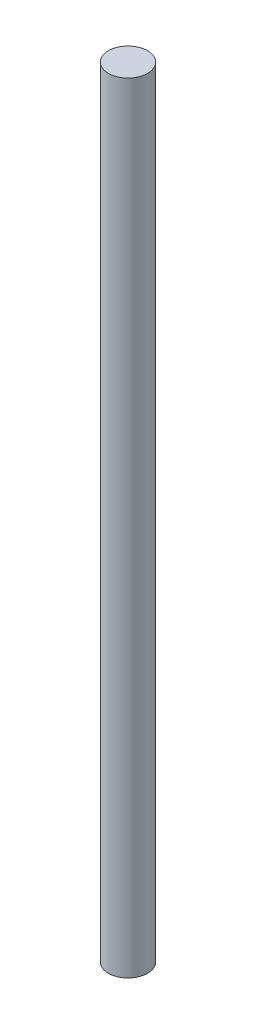
ISO-10303-21;
HEADER;
FILE_DESCRIPTION(('STEP AP214'),'2;1');
FILE_NAME('part.step','',(''),(''),'','','');
FILE_SCHEMA(('AUTOMOTIVE_DESIGN { 1 0 10303 214 1 1 1 1 }'));
ENDSEC;
DATA;
#1=APPLICATION_CONTEXT('core data for automotive mechanical design processes');
#2=APPLICATION_PROTOCOL_DEFINITION('international standard','automotive_design',2000,#1);
#3=PRODUCT_CONTEXT('',#1,'mechanical');
#4=PRODUCT('Part','Part','',(#3));
#5=PRODUCT_RELATED_PRODUCT_CATEGORY('part','',(#4));
#6=PRODUCT_DEFINITION_FORMATION('','',#4);
#7=PRODUCT_DEFINITION_CONTEXT('part definition',#1,'design');
#8=PRODUCT_DEFINITION('design','',#6,#7);
#9=PRODUCT_DEFINITION_SHAPE('','',#8);
#10=(LENGTH_UNIT() NAMED_UNIT(*) SI_UNIT(.MILLI.,.METRE.));
#11=(NAMED_UNIT(*) PLANE_ANGLE_UNIT() SI_UNIT($,.RADIAN.));
#12=(NAMED_UNIT(*) SI_UNIT($,.STERADIAN.) SOLID_ANGLE_UNIT());
#13=UNCERTAINTY_MEASURE_WITH_UNIT(LENGTH_MEASURE(1.E-05),#10,'distance_accuracy_value','');
#14=(GEOMETRIC_REPRESENTATION_CONTEXT(3) GLOBAL_UNCERTAINTY_ASSIGNED_CONTEXT((#13)) GLOBAL_UNIT_ASSIGNED_CONTEXT((#10,
#11,#12)) REPRESENTATION_CONTEXT('',''));
#15=CARTESIAN_POINT('',(0.,0.,0.));
#16=DIRECTION('',(0.,0.,1.));
#17=DIRECTION('',(1.,0.,0.));
#18=AXIS2_PLACEMENT_3D('',#15,#16,#17);
#19=CARTESIAN_POINT('',(0.,80.,0.));
#20=DIRECTION('',(0.,-1.,0.));
#21=DIRECTION('',(0.,0.,-1.));
#22=AXIS2_PLACEMENT_3D('',#19,#20,#21);
#23=CYLINDRICAL_SURFACE('',#22,2.015);
#24=CARTESIAN_POINT('',(0.,80.,0.));
#25=DIRECTION('',(0.,1.,0.));
#26=DIRECTION('',(0.,0.,1.));
#27=AXIS2_PLACEMENT_3D('',#24,#25,#26);
#28=CIRCLE('',#27,2.015);
#29=CARTESIAN_POINT('',(0.,80.,2.015));
#30=VERTEX_POINT('',#29);
#31=EDGE_CURVE('E10',#30,#30,#28,.T.);
#32=ORIENTED_EDGE('',*,*,#31,.F.);
#33=EDGE_LOOP('',(#32));
#34=FACE_BOUND('',#33,.T.);
#35=CARTESIAN_POINT('',(0.,0.,0.));
#36=DIRECTION('',(0.,1.,0.));
#37=DIRECTION('',(0.,0.,1.));
#38=AXIS2_PLACEMENT_3D('',#35,#36,#37);
#39=CIRCLE('',#38,2.015);
#40=CARTESIAN_POINT('',(0.,0.,2.015));
#41=VERTEX_POINT('',#40);
#42=EDGE_CURVE('E39',#41,#41,#39,.T.);
#43=ORIENTED_EDGE('',*,*,#42,.T.);
#44=EDGE_LOOP('',(#43));
#45=FACE_BOUND('',#44,.T.);
#46=ADVANCED_FACE('F36',(#34,#45),#23,.T.);
#47=CARTESIAN_POINT('',(0.,80.,0.));
#48=DIRECTION('',(0.,1.,0.));
#49=DIRECTION('',(0.,0.,1.));
#50=AXIS2_PLACEMENT_3D('',#47,#48,#49);
#51=PLANE('',#50);
#52=ORIENTED_EDGE('',*,*,#31,.T.);
#53=EDGE_LOOP('',(#52));
#54=FACE_BOUND('',#53,.T.);
#55=ADVANCED_FACE('F51',(#54),#51,.T.);
#56=CARTESIAN_POINT('',(0.,0.,0.));
#57=DIRECTION('',(0.,1.,0.));
#58=DIRECTION('',(0.,0.,1.));
#59=AXIS2_PLACEMENT_3D('',#56,#57,#58);
#60=PLANE('',#59);
#61=ORIENTED_EDGE('',*,*,#42,.F.);
#62=EDGE_LOOP('',(#61));
#63=FACE_BOUND('',#62,.T.);
#64=ADVANCED_FACE('F49',(#63),#60,.F.);
#65=CLOSED_SHELL('',(#46,#55,#64));
#66=MANIFOLD_SOLID_BREP('B2',#65);
#67=ADVANCED_BREP_SHAPE_REPRESENTATION('',(#18,#66),#14);
#68=SHAPE_DEFINITION_REPRESENTATION(#9,#67);
ENDSEC;
END-ISO-10303-21;
